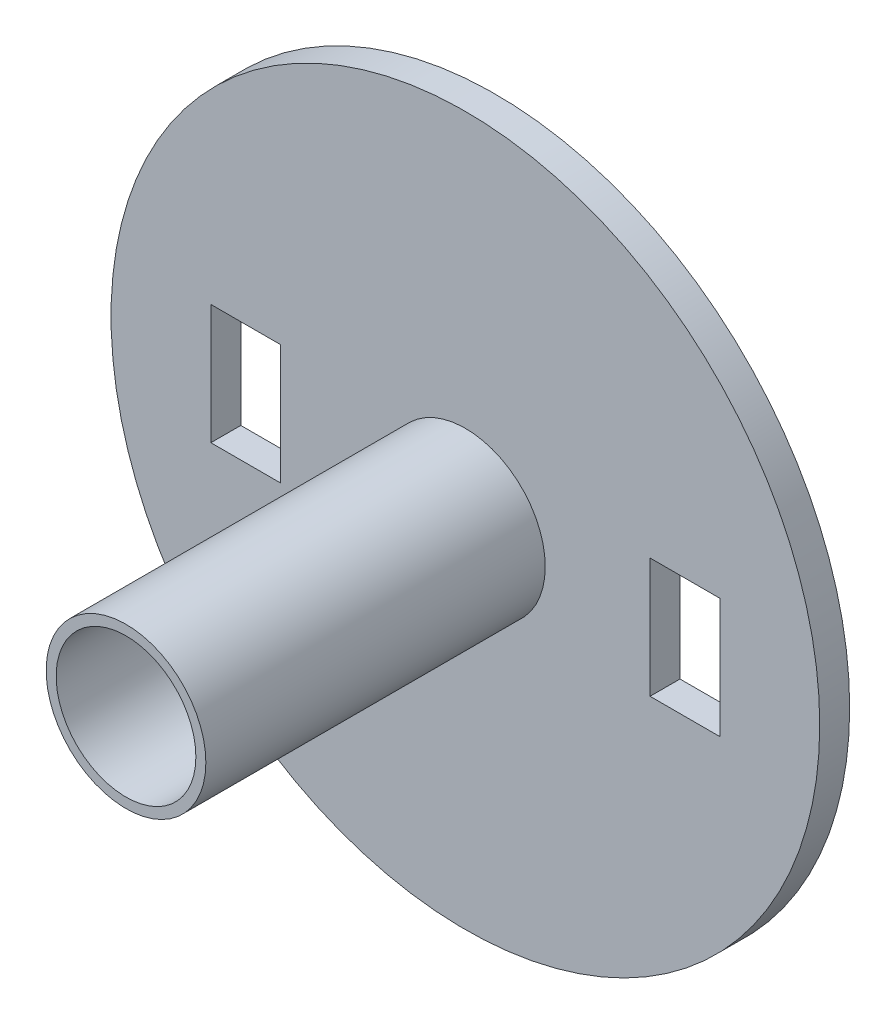
ISO-10303-21;
HEADER;
FILE_DESCRIPTION(('STEP AP214'),'2;1');
FILE_NAME('part.step','',(''),(''),'','','');
FILE_SCHEMA(('AUTOMOTIVE_DESIGN { 1 0 10303 214 1 1 1 1 }'));
ENDSEC;
DATA;
#1=APPLICATION_CONTEXT('core data for automotive mechanical design processes');
#2=APPLICATION_PROTOCOL_DEFINITION('international standard','automotive_design',2000,#1);
#3=PRODUCT_CONTEXT('',#1,'mechanical');
#4=PRODUCT('Part','Part','',(#3));
#5=PRODUCT_RELATED_PRODUCT_CATEGORY('part','',(#4));
#6=PRODUCT_DEFINITION_FORMATION('','',#4);
#7=PRODUCT_DEFINITION_CONTEXT('part definition',#1,'design');
#8=PRODUCT_DEFINITION('design','',#6,#7);
#9=PRODUCT_DEFINITION_SHAPE('','',#8);
#10=(LENGTH_UNIT() NAMED_UNIT(*) SI_UNIT(.MILLI.,.METRE.));
#11=(NAMED_UNIT(*) PLANE_ANGLE_UNIT() SI_UNIT($,.RADIAN.));
#12=(NAMED_UNIT(*) SI_UNIT($,.STERADIAN.) SOLID_ANGLE_UNIT());
#13=UNCERTAINTY_MEASURE_WITH_UNIT(LENGTH_MEASURE(1.E-05),#10,'distance_accuracy_value','');
#14=(GEOMETRIC_REPRESENTATION_CONTEXT(3) GLOBAL_UNCERTAINTY_ASSIGNED_CONTEXT((#13)) GLOBAL_UNIT_ASSIGNED_CONTEXT((#10,
#11,#12)) REPRESENTATION_CONTEXT('',''));
#15=CARTESIAN_POINT('',(0.,0.,0.));
#16=DIRECTION('',(0.,0.,1.));
#17=DIRECTION('',(1.,0.,0.));
#18=AXIS2_PLACEMENT_3D('',#15,#16,#17);
#19=CARTESIAN_POINT('',(0.,0.,1.5));
#20=DIRECTION('',(0.,0.,-1.));
#21=DIRECTION('',(-1.,0.,0.));
#22=AXIS2_PLACEMENT_3D('',#19,#20,#21);
#23=CYLINDRICAL_SURFACE('',#22,17.75);
#24=CARTESIAN_POINT('',(0.,0.,1.5));
#25=DIRECTION('',(0.,0.,1.));
#26=DIRECTION('',(1.,0.,0.));
#27=AXIS2_PLACEMENT_3D('',#24,#25,#26);
#28=CIRCLE('',#27,17.75);
#29=CARTESIAN_POINT('',(17.75,0.,1.5));
#30=VERTEX_POINT('',#29);
#31=EDGE_CURVE('E50',#30,#30,#28,.T.);
#32=ORIENTED_EDGE('',*,*,#31,.F.);
#33=EDGE_LOOP('',(#32));
#34=FACE_BOUND('',#33,.T.);
#35=CARTESIAN_POINT('',(0.,0.,0.));
#36=DIRECTION('',(0.,0.,1.));
#37=DIRECTION('',(1.,0.,0.));
#38=AXIS2_PLACEMENT_3D('',#35,#36,#37);
#39=CIRCLE('',#38,17.75);
#40=CARTESIAN_POINT('',(17.75,0.,0.));
#41=VERTEX_POINT('',#40);
#42=EDGE_CURVE('E44',#41,#41,#39,.T.);
#43=ORIENTED_EDGE('',*,*,#42,.T.);
#44=EDGE_LOOP('',(#43));
#45=FACE_BOUND('',#44,.T.);
#46=ADVANCED_FACE('F41',(#34,#45),#23,.T.);
#47=CARTESIAN_POINT('',(0.,0.,1.5));
#48=DIRECTION('',(0.,0.,1.));
#49=DIRECTION('',(1.,0.,0.));
#50=AXIS2_PLACEMENT_3D('',#47,#48,#49);
#51=PLANE('',#50);
#52=DIRECTION('',(0.,1.,0.));
#53=VECTOR('',#52,1.);
#54=CARTESIAN_POINT('',(12.75,0.,1.5));
#55=LINE('',#54,#53);
#56=CARTESIAN_POINT('',(12.75,-3.,1.5));
#57=VERTEX_POINT('',#56);
#58=CARTESIAN_POINT('',(12.75,3.,1.5));
#59=VERTEX_POINT('',#58);
#60=EDGE_CURVE('E206',#57,#59,#55,.T.);
#61=ORIENTED_EDGE('',*,*,#60,.F.);
#62=DIRECTION('',(1.,0.,0.));
#63=VECTOR('',#62,1.);
#64=CARTESIAN_POINT('',(0.,-3.,1.5));
#65=LINE('',#64,#63);
#66=CARTESIAN_POINT('',(9.25,-3.,1.5));
#67=VERTEX_POINT('',#66);
#68=EDGE_CURVE('E203',#67,#57,#65,.T.);
#69=ORIENTED_EDGE('',*,*,#68,.F.);
#70=DIRECTION('',(0.,-1.,0.));
#71=VECTOR('',#70,1.);
#72=CARTESIAN_POINT('',(9.25,0.,1.5));
#73=LINE('',#72,#71);
#74=CARTESIAN_POINT('',(9.25,3.,1.5));
#75=VERTEX_POINT('',#74);
#76=EDGE_CURVE('E200',#75,#67,#73,.T.);
#77=ORIENTED_EDGE('',*,*,#76,.F.);
#78=DIRECTION('',(-1.,0.,0.));
#79=VECTOR('',#78,1.);
#80=CARTESIAN_POINT('',(0.,3.,1.5));
#81=LINE('',#80,#79);
#82=EDGE_CURVE('E197',#59,#75,#81,.T.);
#83=ORIENTED_EDGE('',*,*,#82,.F.);
#84=EDGE_LOOP('',(#61,#69,#77,#83));
#85=FACE_BOUND('',#84,.T.);
#86=DIRECTION('',(0.,1.,0.));
#87=VECTOR('',#86,1.);
#88=CARTESIAN_POINT('',(-9.25,0.,1.5));
#89=LINE('',#88,#87);
#90=CARTESIAN_POINT('',(-9.25,-3.,1.5));
#91=VERTEX_POINT('',#90);
#92=CARTESIAN_POINT('',(-9.25,3.,1.5));
#93=VERTEX_POINT('',#92);
#94=EDGE_CURVE('E113',#91,#93,#89,.T.);
#95=ORIENTED_EDGE('',*,*,#94,.F.);
#96=DIRECTION('',(1.,0.,0.));
#97=VECTOR('',#96,1.);
#98=CARTESIAN_POINT('',(0.,-3.,1.5));
#99=LINE('',#98,#97);
#100=CARTESIAN_POINT('',(-12.75,-3.,1.5));
#101=VERTEX_POINT('',#100);
#102=EDGE_CURVE('E192',#101,#91,#99,.T.);
#103=ORIENTED_EDGE('',*,*,#102,.F.);
#104=DIRECTION('',(0.,-1.,0.));
#105=VECTOR('',#104,1.);
#106=CARTESIAN_POINT('',(-12.75,0.,1.5));
#107=LINE('',#106,#105);
#108=CARTESIAN_POINT('',(-12.75,3.,1.5));
#109=VERTEX_POINT('',#108);
#110=EDGE_CURVE('E189',#109,#101,#107,.T.);
#111=ORIENTED_EDGE('',*,*,#110,.F.);
#112=DIRECTION('',(-1.,0.,0.));
#113=VECTOR('',#112,1.);
#114=CARTESIAN_POINT('',(0.,3.,1.5));
#115=LINE('',#114,#113);
#116=EDGE_CURVE('E183',#93,#109,#115,.T.);
#117=ORIENTED_EDGE('',*,*,#116,.F.);
#118=EDGE_LOOP('',(#95,#103,#111,#117));
#119=FACE_BOUND('',#118,.T.);
#120=CARTESIAN_POINT('',(0.,0.,1.5));
#121=DIRECTION('',(0.,0.,1.));
#122=DIRECTION('',(1.,0.,0.));
#123=AXIS2_PLACEMENT_3D('',#120,#121,#122);
#124=CIRCLE('',#123,4.);
#125=CARTESIAN_POINT('',(4.,0.,1.5));
#126=VERTEX_POINT('',#125);
#127=EDGE_CURVE('E11',#126,#126,#124,.T.);
#128=ORIENTED_EDGE('',*,*,#127,.F.);
#129=EDGE_LOOP('',(#128));
#130=FACE_BOUND('',#129,.T.);
#131=ORIENTED_EDGE('',*,*,#31,.T.);
#132=EDGE_LOOP('',(#131));
#133=FACE_BOUND('',#132,.T.);
#134=ADVANCED_FACE('F223',(#85,#119,#130,#133),#51,.T.);
#135=CARTESIAN_POINT('',(0.,0.,0.));
#136=DIRECTION('',(0.,0.,1.));
#137=DIRECTION('',(1.,0.,0.));
#138=AXIS2_PLACEMENT_3D('',#135,#136,#137);
#139=PLANE('',#138);
#140=DIRECTION('',(1.,0.,0.));
#141=VECTOR('',#140,1.);
#142=CARTESIAN_POINT('',(12.75,-3.,0.));
#143=LINE('',#142,#141);
#144=CARTESIAN_POINT('',(9.25,-3.,0.));
#145=VERTEX_POINT('',#144);
#146=CARTESIAN_POINT('',(12.75,-3.,0.));
#147=VERTEX_POINT('',#146);
#148=EDGE_CURVE('E166',#145,#147,#143,.T.);
#149=ORIENTED_EDGE('',*,*,#148,.T.);
#150=DIRECTION('',(0.,1.,0.));
#151=VECTOR('',#150,1.);
#152=CARTESIAN_POINT('',(12.75,3.,0.));
#153=LINE('',#152,#151);
#154=CARTESIAN_POINT('',(12.75,3.,0.));
#155=VERTEX_POINT('',#154);
#156=EDGE_CURVE('E154',#147,#155,#153,.T.);
#157=ORIENTED_EDGE('',*,*,#156,.T.);
#158=DIRECTION('',(-1.,0.,0.));
#159=VECTOR('',#158,1.);
#160=CARTESIAN_POINT('',(12.75,3.,0.));
#161=LINE('',#160,#159);
#162=CARTESIAN_POINT('',(9.25,3.,0.));
#163=VERTEX_POINT('',#162);
#164=EDGE_CURVE('E158',#155,#163,#161,.T.);
#165=ORIENTED_EDGE('',*,*,#164,.T.);
#166=DIRECTION('',(0.,-1.,0.));
#167=VECTOR('',#166,1.);
#168=CARTESIAN_POINT('',(9.25,3.,0.));
#169=LINE('',#168,#167);
#170=EDGE_CURVE('E162',#163,#145,#169,.T.);
#171=ORIENTED_EDGE('',*,*,#170,.T.);
#172=EDGE_LOOP('',(#149,#157,#165,#171));
#173=FACE_BOUND('',#172,.T.);
#174=DIRECTION('',(1.,0.,0.));
#175=VECTOR('',#174,1.);
#176=CARTESIAN_POINT('',(-12.75,-3.,0.));
#177=LINE('',#176,#175);
#178=CARTESIAN_POINT('',(-12.75,-3.,0.));
#179=VERTEX_POINT('',#178);
#180=CARTESIAN_POINT('',(-9.25,-3.,0.));
#181=VERTEX_POINT('',#180);
#182=EDGE_CURVE('E117',#179,#181,#177,.T.);
#183=ORIENTED_EDGE('',*,*,#182,.T.);
#184=DIRECTION('',(0.,1.,0.));
#185=VECTOR('',#184,1.);
#186=CARTESIAN_POINT('',(-9.25,3.,0.));
#187=LINE('',#186,#185);
#188=CARTESIAN_POINT('',(-9.25,3.,0.));
#189=VERTEX_POINT('',#188);
#190=EDGE_CURVE('E110',#181,#189,#187,.T.);
#191=ORIENTED_EDGE('',*,*,#190,.T.);
#192=DIRECTION('',(-1.,0.,0.));
#193=VECTOR('',#192,1.);
#194=CARTESIAN_POINT('',(-12.75,3.,0.));
#195=LINE('',#194,#193);
#196=CARTESIAN_POINT('',(-12.75,3.,0.));
#197=VERTEX_POINT('',#196);
#198=EDGE_CURVE('E121',#189,#197,#195,.T.);
#199=ORIENTED_EDGE('',*,*,#198,.T.);
#200=DIRECTION('',(0.,-1.,0.));
#201=VECTOR('',#200,1.);
#202=CARTESIAN_POINT('',(-12.75,3.,0.));
#203=LINE('',#202,#201);
#204=EDGE_CURVE('E127',#197,#179,#203,.T.);
#205=ORIENTED_EDGE('',*,*,#204,.T.);
#206=EDGE_LOOP('',(#183,#191,#199,#205));
#207=FACE_BOUND('',#206,.T.);
#208=CARTESIAN_POINT('',(0.,0.,0.));
#209=DIRECTION('',(0.,0.,1.));
#210=DIRECTION('',(1.,0.,0.));
#211=AXIS2_PLACEMENT_3D('',#208,#209,#210);
#212=CIRCLE('',#211,3.5);
#213=CARTESIAN_POINT('',(3.5,0.,0.));
#214=VERTEX_POINT('',#213);
#215=EDGE_CURVE('E179',#214,#214,#212,.T.);
#216=ORIENTED_EDGE('',*,*,#215,.T.);
#217=EDGE_LOOP('',(#216));
#218=FACE_BOUND('',#217,.T.);
#219=ORIENTED_EDGE('',*,*,#42,.F.);
#220=EDGE_LOOP('',(#219));
#221=FACE_BOUND('',#220,.T.);
#222=ADVANCED_FACE('F129',(#173,#207,#218,#221),#139,.F.);
#223=CARTESIAN_POINT('',(0.,0.,18.5));
#224=DIRECTION('',(0.,0.,-1.));
#225=DIRECTION('',(-1.,0.,0.));
#226=AXIS2_PLACEMENT_3D('',#223,#224,#225);
#227=CYLINDRICAL_SURFACE('',#226,4.);
#228=CARTESIAN_POINT('',(0.,0.,18.5));
#229=DIRECTION('',(0.,0.,1.));
#230=DIRECTION('',(1.,0.,0.));
#231=AXIS2_PLACEMENT_3D('',#228,#229,#230);
#232=CIRCLE('',#231,4.);
#233=CARTESIAN_POINT('',(4.,0.,18.5));
#234=VERTEX_POINT('',#233);
#235=EDGE_CURVE('E209',#234,#234,#232,.T.);
#236=ORIENTED_EDGE('',*,*,#235,.F.);
#237=EDGE_LOOP('',(#236));
#238=FACE_BOUND('',#237,.T.);
#239=ORIENTED_EDGE('',*,*,#127,.T.);
#240=EDGE_LOOP('',(#239));
#241=FACE_BOUND('',#240,.T.);
#242=ADVANCED_FACE('F222',(#238,#241),#227,.T.);
#243=CARTESIAN_POINT('',(0.,0.,18.5));
#244=DIRECTION('',(0.,0.,1.));
#245=DIRECTION('',(1.,0.,0.));
#246=AXIS2_PLACEMENT_3D('',#243,#244,#245);
#247=PLANE('',#246);
#248=CARTESIAN_POINT('',(0.,0.,18.5));
#249=DIRECTION('',(0.,0.,1.));
#250=DIRECTION('',(1.,0.,0.));
#251=AXIS2_PLACEMENT_3D('',#248,#249,#250);
#252=CIRCLE('',#251,3.5);
#253=CARTESIAN_POINT('',(3.5,0.,18.5));
#254=VERTEX_POINT('',#253);
#255=EDGE_CURVE('E147',#254,#254,#252,.T.);
#256=ORIENTED_EDGE('',*,*,#255,.F.);
#257=EDGE_LOOP('',(#256));
#258=FACE_BOUND('',#257,.T.);
#259=ORIENTED_EDGE('',*,*,#235,.T.);
#260=EDGE_LOOP('',(#259));
#261=FACE_BOUND('',#260,.T.);
#262=ADVANCED_FACE('F229',(#258,#261),#247,.T.);
#263=CARTESIAN_POINT('',(0.,0.,0.));
#264=DIRECTION('',(0.,0.,1.));
#265=DIRECTION('',(1.,0.,0.));
#266=AXIS2_PLACEMENT_3D('',#263,#264,#265);
#267=CYLINDRICAL_SURFACE('',#266,3.5);
#268=ORIENTED_EDGE('',*,*,#215,.F.);
#269=EDGE_LOOP('',(#268));
#270=FACE_BOUND('',#269,.T.);
#271=ORIENTED_EDGE('',*,*,#255,.T.);
#272=EDGE_LOOP('',(#271));
#273=FACE_BOUND('',#272,.T.);
#274=ADVANCED_FACE('F258',(#270,#273),#267,.F.);
#275=CARTESIAN_POINT('',(-9.25,3.,0.));
#276=DIRECTION('',(1.,0.,0.));
#277=DIRECTION('',(0.,1.,0.));
#278=AXIS2_PLACEMENT_3D('',#275,#276,#277);
#279=PLANE('',#278);
#280=ORIENTED_EDGE('',*,*,#94,.T.);
#281=DIRECTION('',(0.,0.,1.));
#282=VECTOR('',#281,1.);
#283=CARTESIAN_POINT('',(-9.25,3.,0.));
#284=LINE('',#283,#282);
#285=EDGE_CURVE('E66',#189,#93,#284,.T.);
#286=ORIENTED_EDGE('',*,*,#285,.F.);
#287=ORIENTED_EDGE('',*,*,#190,.F.);
#288=DIRECTION('',(0.,0.,1.));
#289=VECTOR('',#288,1.);
#290=CARTESIAN_POINT('',(-9.25,-3.,0.));
#291=LINE('',#290,#289);
#292=EDGE_CURVE('E144',#181,#91,#291,.T.);
#293=ORIENTED_EDGE('',*,*,#292,.T.);
#294=EDGE_LOOP('',(#280,#286,#287,#293));
#295=FACE_BOUND('',#294,.T.);
#296=ADVANCED_FACE('F107',(#295),#279,.F.);
#297=CARTESIAN_POINT('',(-12.75,-3.,0.));
#298=DIRECTION('',(0.,-1.,0.));
#299=DIRECTION('',(0.,0.,-1.));
#300=AXIS2_PLACEMENT_3D('',#297,#298,#299);
#301=PLANE('',#300);
#302=ORIENTED_EDGE('',*,*,#102,.T.);
#303=ORIENTED_EDGE('',*,*,#292,.F.);
#304=ORIENTED_EDGE('',*,*,#182,.F.);
#305=DIRECTION('',(0.,0.,1.));
#306=VECTOR('',#305,1.);
#307=CARTESIAN_POINT('',(-12.75,-3.,0.));
#308=LINE('',#307,#306);
#309=EDGE_CURVE('E148',#179,#101,#308,.T.);
#310=ORIENTED_EDGE('',*,*,#309,.T.);
#311=EDGE_LOOP('',(#302,#303,#304,#310));
#312=FACE_BOUND('',#311,.T.);
#313=ADVANCED_FACE('F277',(#312),#301,.F.);
#314=CARTESIAN_POINT('',(-12.75,3.,0.));
#315=DIRECTION('',(-1.,0.,0.));
#316=DIRECTION('',(0.,0.,1.));
#317=AXIS2_PLACEMENT_3D('',#314,#315,#316);
#318=PLANE('',#317);
#319=ORIENTED_EDGE('',*,*,#110,.T.);
#320=ORIENTED_EDGE('',*,*,#309,.F.);
#321=ORIENTED_EDGE('',*,*,#204,.F.);
#322=DIRECTION('',(0.,0.,1.));
#323=VECTOR('',#322,1.);
#324=CARTESIAN_POINT('',(-12.75,3.,0.));
#325=LINE('',#324,#323);
#326=EDGE_CURVE('E116',#197,#109,#325,.T.);
#327=ORIENTED_EDGE('',*,*,#326,.T.);
#328=EDGE_LOOP('',(#319,#320,#321,#327));
#329=FACE_BOUND('',#328,.T.);
#330=ADVANCED_FACE('F286',(#329),#318,.F.);
#331=CARTESIAN_POINT('',(-12.75,3.,0.));
#332=DIRECTION('',(0.,1.,0.));
#333=DIRECTION('',(0.,0.,1.));
#334=AXIS2_PLACEMENT_3D('',#331,#332,#333);
#335=PLANE('',#334);
#336=ORIENTED_EDGE('',*,*,#116,.T.);
#337=ORIENTED_EDGE('',*,*,#326,.F.);
#338=ORIENTED_EDGE('',*,*,#198,.F.);
#339=ORIENTED_EDGE('',*,*,#285,.T.);
#340=EDGE_LOOP('',(#336,#337,#338,#339));
#341=FACE_BOUND('',#340,.T.);
#342=ADVANCED_FACE('F122',(#341),#335,.F.);
#343=CARTESIAN_POINT('',(12.75,3.,0.));
#344=DIRECTION('',(1.,0.,0.));
#345=DIRECTION('',(0.,0.,-1.));
#346=AXIS2_PLACEMENT_3D('',#343,#344,#345);
#347=PLANE('',#346);
#348=ORIENTED_EDGE('',*,*,#60,.T.);
#349=DIRECTION('',(0.,0.,1.));
#350=VECTOR('',#349,1.);
#351=CARTESIAN_POINT('',(12.75,3.,0.));
#352=LINE('',#351,#350);
#353=EDGE_CURVE('E58',#155,#59,#352,.T.);
#354=ORIENTED_EDGE('',*,*,#353,.F.);
#355=ORIENTED_EDGE('',*,*,#156,.F.);
#356=DIRECTION('',(0.,0.,1.));
#357=VECTOR('',#356,1.);
#358=CARTESIAN_POINT('',(12.75,-3.,0.));
#359=LINE('',#358,#357);
#360=EDGE_CURVE('E133',#147,#57,#359,.T.);
#361=ORIENTED_EDGE('',*,*,#360,.T.);
#362=EDGE_LOOP('',(#348,#354,#355,#361));
#363=FACE_BOUND('',#362,.T.);
#364=ADVANCED_FACE('F305',(#363),#347,.F.);
#365=CARTESIAN_POINT('',(12.75,-3.,0.));
#366=DIRECTION('',(0.,-1.,0.));
#367=DIRECTION('',(0.,0.,-1.));
#368=AXIS2_PLACEMENT_3D('',#365,#366,#367);
#369=PLANE('',#368);
#370=ORIENTED_EDGE('',*,*,#68,.T.);
#371=ORIENTED_EDGE('',*,*,#360,.F.);
#372=ORIENTED_EDGE('',*,*,#148,.F.);
#373=DIRECTION('',(0.,0.,1.));
#374=VECTOR('',#373,1.);
#375=CARTESIAN_POINT('',(9.25,-3.,0.));
#376=LINE('',#375,#374);
#377=EDGE_CURVE('E137',#145,#67,#376,.T.);
#378=ORIENTED_EDGE('',*,*,#377,.T.);
#379=EDGE_LOOP('',(#370,#371,#372,#378));
#380=FACE_BOUND('',#379,.T.);
#381=ADVANCED_FACE('F314',(#380),#369,.F.);
#382=CARTESIAN_POINT('',(9.25,3.,0.));
#383=DIRECTION('',(-1.,0.,0.));
#384=DIRECTION('',(0.,-1.,0.));
#385=AXIS2_PLACEMENT_3D('',#382,#383,#384);
#386=PLANE('',#385);
#387=ORIENTED_EDGE('',*,*,#76,.T.);
#388=ORIENTED_EDGE('',*,*,#377,.F.);
#389=ORIENTED_EDGE('',*,*,#170,.F.);
#390=DIRECTION('',(0.,0.,1.));
#391=VECTOR('',#390,1.);
#392=CARTESIAN_POINT('',(9.25,3.,0.));
#393=LINE('',#392,#391);
#394=EDGE_CURVE('E173',#163,#75,#393,.T.);
#395=ORIENTED_EDGE('',*,*,#394,.T.);
#396=EDGE_LOOP('',(#387,#388,#389,#395));
#397=FACE_BOUND('',#396,.T.);
#398=ADVANCED_FACE('F324',(#397),#386,.F.);
#399=CARTESIAN_POINT('',(12.75,3.,0.));
#400=DIRECTION('',(0.,1.,0.));
#401=DIRECTION('',(0.,0.,1.));
#402=AXIS2_PLACEMENT_3D('',#399,#400,#401);
#403=PLANE('',#402);
#404=ORIENTED_EDGE('',*,*,#82,.T.);
#405=ORIENTED_EDGE('',*,*,#394,.F.);
#406=ORIENTED_EDGE('',*,*,#164,.F.);
#407=ORIENTED_EDGE('',*,*,#353,.T.);
#408=EDGE_LOOP('',(#404,#405,#406,#407));
#409=FACE_BOUND('',#408,.T.);
#410=ADVANCED_FACE('F334',(#409),#403,.F.);
#411=CLOSED_SHELL('',(#46,#134,#222,#242,#262,#274,#296,#313,#330,#342,#364,#381,#398,#410));
#412=MANIFOLD_SOLID_BREP('B2',#411);
#413=ADVANCED_BREP_SHAPE_REPRESENTATION('',(#18,#412),#14);
#414=SHAPE_DEFINITION_REPRESENTATION(#9,#413);
ENDSEC;
END-ISO-10303-21;
